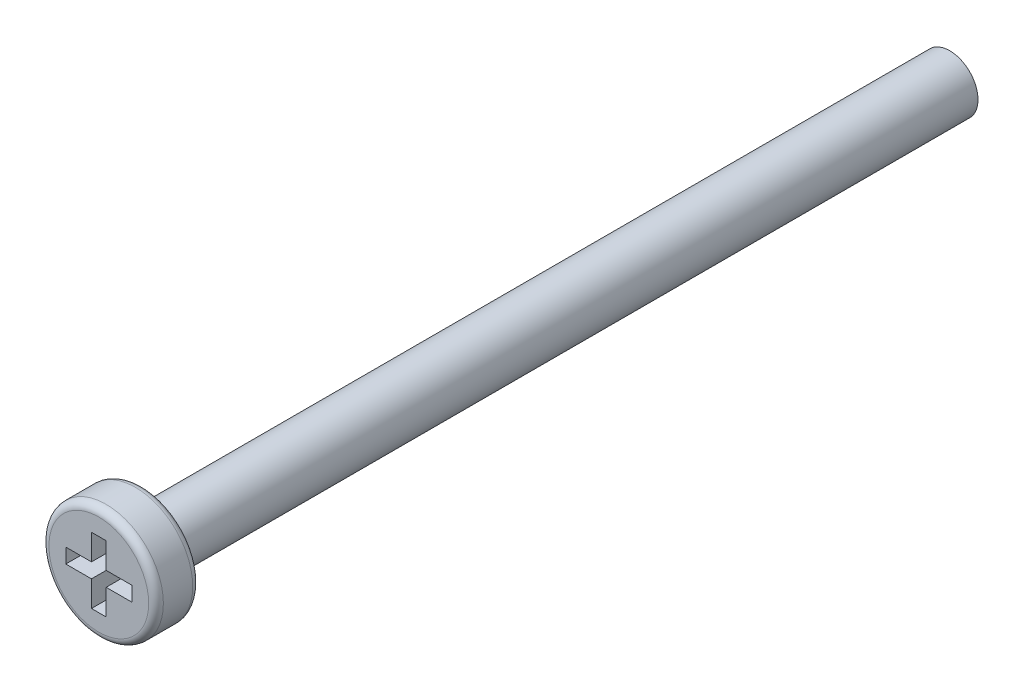
ISO-10303-21;
HEADER;
FILE_DESCRIPTION(('STEP AP214'),'2;1');
FILE_NAME('part.step','',(''),(''),'','','');
FILE_SCHEMA(('AUTOMOTIVE_DESIGN { 1 0 10303 214 1 1 1 1 }'));
ENDSEC;
DATA;
#1=APPLICATION_CONTEXT('core data for automotive mechanical design processes');
#2=APPLICATION_PROTOCOL_DEFINITION('international standard','automotive_design',2000,#1);
#3=PRODUCT_CONTEXT('',#1,'mechanical');
#4=PRODUCT('Part','Part','',(#3));
#5=PRODUCT_RELATED_PRODUCT_CATEGORY('part','',(#4));
#6=PRODUCT_DEFINITION_FORMATION('','',#4);
#7=PRODUCT_DEFINITION_CONTEXT('part definition',#1,'design');
#8=PRODUCT_DEFINITION('design','',#6,#7);
#9=PRODUCT_DEFINITION_SHAPE('','',#8);
#10=(LENGTH_UNIT() NAMED_UNIT(*) SI_UNIT(.MILLI.,.METRE.));
#11=(NAMED_UNIT(*) PLANE_ANGLE_UNIT() SI_UNIT($,.RADIAN.));
#12=(NAMED_UNIT(*) SI_UNIT($,.STERADIAN.) SOLID_ANGLE_UNIT());
#13=UNCERTAINTY_MEASURE_WITH_UNIT(LENGTH_MEASURE(1.E-05),#10,'distance_accuracy_value','');
#14=(GEOMETRIC_REPRESENTATION_CONTEXT(3) GLOBAL_UNCERTAINTY_ASSIGNED_CONTEXT((#13)) GLOBAL_UNIT_ASSIGNED_CONTEXT((#10,
#11,#12)) REPRESENTATION_CONTEXT('',''));
#15=CARTESIAN_POINT('',(0.,0.,0.));
#16=DIRECTION('',(0.,0.,1.));
#17=DIRECTION('',(1.,0.,0.));
#18=AXIS2_PLACEMENT_3D('',#15,#16,#17);
#19=CARTESIAN_POINT('',(0.,0.,0.));
#20=DIRECTION('',(0.,0.,1.));
#21=DIRECTION('',(1.,0.,0.));
#22=AXIS2_PLACEMENT_3D('',#19,#20,#21);
#23=PLANE('',#22);
#24=CARTESIAN_POINT('',(0.,0.,0.));
#25=DIRECTION('',(0.,0.,1.));
#26=DIRECTION('',(1.,0.,0.));
#27=AXIS2_PLACEMENT_3D('',#24,#25,#26);
#28=CIRCLE('',#27,3.4);
#29=CARTESIAN_POINT('',(3.4,0.,0.));
#30=VERTEX_POINT('',#29);
#31=EDGE_CURVE('E217',#30,#30,#28,.F.);
#32=ORIENTED_EDGE('',*,*,#31,.T.);
#33=EDGE_LOOP('',(#32));
#34=FACE_BOUND('',#33,.T.);
#35=CARTESIAN_POINT('',(0.,0.,0.));
#36=DIRECTION('',(0.,0.,1.));
#37=DIRECTION('',(1.,0.,0.));
#38=AXIS2_PLACEMENT_3D('',#35,#36,#37);
#39=CIRCLE('',#38,1.925);
#40=CARTESIAN_POINT('',(1.925,0.,0.));
#41=VERTEX_POINT('',#40);
#42=EDGE_CURVE('E11',#41,#41,#39,.F.);
#43=ORIENTED_EDGE('',*,*,#42,.F.);
#44=EDGE_LOOP('',(#43));
#45=FACE_BOUND('',#44,.T.);
#46=ADVANCED_FACE('F37',(#34,#45),#23,.F.);
#47=CARTESIAN_POINT('',(0.,0.,3.));
#48=DIRECTION('',(0.,0.,-1.));
#49=DIRECTION('',(-1.,0.,0.));
#50=AXIS2_PLACEMENT_3D('',#47,#48,#49);
#51=CYLINDRICAL_SURFACE('',#50,3.9);
#52=CARTESIAN_POINT('',(0.,0.,0.5));
#53=DIRECTION('',(0.,0.,1.));
#54=DIRECTION('',(1.,0.,0.));
#55=AXIS2_PLACEMENT_3D('',#52,#53,#54);
#56=CIRCLE('',#55,3.9);
#57=CARTESIAN_POINT('',(3.9,0.,0.5));
#58=VERTEX_POINT('',#57);
#59=EDGE_CURVE('E214',#58,#58,#56,.T.);
#60=ORIENTED_EDGE('',*,*,#59,.T.);
#61=EDGE_LOOP('',(#60));
#62=FACE_BOUND('',#61,.T.);
#63=CARTESIAN_POINT('',(0.,0.,2.5));
#64=DIRECTION('',(0.,0.,1.));
#65=DIRECTION('',(1.,0.,0.));
#66=AXIS2_PLACEMENT_3D('',#63,#64,#65);
#67=CIRCLE('',#66,3.9);
#68=CARTESIAN_POINT('',(3.9,0.,2.5));
#69=VERTEX_POINT('',#68);
#70=EDGE_CURVE('E194',#69,#69,#67,.F.);
#71=ORIENTED_EDGE('',*,*,#70,.T.);
#72=EDGE_LOOP('',(#71));
#73=FACE_BOUND('',#72,.T.);
#74=ADVANCED_FACE('F239',(#62,#73),#51,.T.);
#75=CARTESIAN_POINT('',(0.,0.,3.));
#76=DIRECTION('',(0.,0.,1.));
#77=DIRECTION('',(1.,0.,0.));
#78=AXIS2_PLACEMENT_3D('',#75,#76,#77);
#79=PLANE('',#78);
#80=CARTESIAN_POINT('',(0.,0.,3.));
#81=DIRECTION('',(0.,0.,1.));
#82=DIRECTION('',(1.,0.,0.));
#83=AXIS2_PLACEMENT_3D('',#80,#81,#82);
#84=CIRCLE('',#83,3.4);
#85=CARTESIAN_POINT('',(3.4,0.,3.));
#86=VERTEX_POINT('',#85);
#87=EDGE_CURVE('E45',#86,#86,#84,.T.);
#88=ORIENTED_EDGE('',*,*,#87,.T.);
#89=EDGE_LOOP('',(#88));
#90=FACE_BOUND('',#89,.T.);
#91=DIRECTION('',(0.,-1.,0.));
#92=VECTOR('',#91,1.);
#93=CARTESIAN_POINT('',(-0.5,-0.5,3.));
#94=LINE('',#93,#92);
#95=CARTESIAN_POINT('',(-0.5,-0.5,3.));
#96=VERTEX_POINT('',#95);
#97=CARTESIAN_POINT('',(-0.5,-2.25,3.));
#98=VERTEX_POINT('',#97);
#99=EDGE_CURVE('E52',#96,#98,#94,.T.);
#100=ORIENTED_EDGE('',*,*,#99,.F.);
#101=DIRECTION('',(1.,0.,0.));
#102=VECTOR('',#101,1.);
#103=CARTESIAN_POINT('',(-0.5,-0.5,3.));
#104=LINE('',#103,#102);
#105=CARTESIAN_POINT('',(-2.25,-0.5,3.));
#106=VERTEX_POINT('',#105);
#107=EDGE_CURVE('E190',#106,#96,#104,.T.);
#108=ORIENTED_EDGE('',*,*,#107,.F.);
#109=DIRECTION('',(0.,-1.,0.));
#110=VECTOR('',#109,1.);
#111=CARTESIAN_POINT('',(-2.25,0.5,3.));
#112=LINE('',#111,#110);
#113=CARTESIAN_POINT('',(-2.25,0.5,3.));
#114=VERTEX_POINT('',#113);
#115=EDGE_CURVE('E188',#114,#106,#112,.T.);
#116=ORIENTED_EDGE('',*,*,#115,.F.);
#117=DIRECTION('',(-1.,0.,0.));
#118=VECTOR('',#117,1.);
#119=CARTESIAN_POINT('',(-0.5,0.5,3.));
#120=LINE('',#119,#118);
#121=CARTESIAN_POINT('',(-0.5,0.5,3.));
#122=VERTEX_POINT('',#121);
#123=EDGE_CURVE('E136',#122,#114,#120,.T.);
#124=ORIENTED_EDGE('',*,*,#123,.F.);
#125=DIRECTION('',(0.,-1.,0.));
#126=VECTOR('',#125,1.);
#127=CARTESIAN_POINT('',(-0.5,2.25,3.));
#128=LINE('',#127,#126);
#129=CARTESIAN_POINT('',(-0.5,2.25,3.));
#130=VERTEX_POINT('',#129);
#131=EDGE_CURVE('E184',#130,#122,#128,.T.);
#132=ORIENTED_EDGE('',*,*,#131,.F.);
#133=DIRECTION('',(-1.,0.,0.));
#134=VECTOR('',#133,1.);
#135=CARTESIAN_POINT('',(0.5,2.25,3.));
#136=LINE('',#135,#134);
#137=CARTESIAN_POINT('',(0.5,2.25,3.));
#138=VERTEX_POINT('',#137);
#139=EDGE_CURVE('E181',#138,#130,#136,.T.);
#140=ORIENTED_EDGE('',*,*,#139,.F.);
#141=DIRECTION('',(0.,1.,0.));
#142=VECTOR('',#141,1.);
#143=CARTESIAN_POINT('',(0.5,2.25,3.));
#144=LINE('',#143,#142);
#145=CARTESIAN_POINT('',(0.5,0.5,3.));
#146=VERTEX_POINT('',#145);
#147=EDGE_CURVE('E178',#146,#138,#144,.T.);
#148=ORIENTED_EDGE('',*,*,#147,.F.);
#149=DIRECTION('',(-1.,0.,0.));
#150=VECTOR('',#149,1.);
#151=CARTESIAN_POINT('',(2.25,0.5,3.));
#152=LINE('',#151,#150);
#153=CARTESIAN_POINT('',(2.25,0.5,3.));
#154=VERTEX_POINT('',#153);
#155=EDGE_CURVE('E175',#154,#146,#152,.T.);
#156=ORIENTED_EDGE('',*,*,#155,.F.);
#157=DIRECTION('',(0.,1.,0.));
#158=VECTOR('',#157,1.);
#159=CARTESIAN_POINT('',(2.25,0.5,3.));
#160=LINE('',#159,#158);
#161=CARTESIAN_POINT('',(2.25,-0.5,3.));
#162=VERTEX_POINT('',#161);
#163=EDGE_CURVE('E172',#162,#154,#160,.T.);
#164=ORIENTED_EDGE('',*,*,#163,.F.);
#165=DIRECTION('',(1.,0.,0.));
#166=VECTOR('',#165,1.);
#167=CARTESIAN_POINT('',(2.25,-0.5,3.));
#168=LINE('',#167,#166);
#169=CARTESIAN_POINT('',(0.5,-0.5,3.));
#170=VERTEX_POINT('',#169);
#171=EDGE_CURVE('E169',#170,#162,#168,.T.);
#172=ORIENTED_EDGE('',*,*,#171,.F.);
#173=DIRECTION('',(0.,1.,0.));
#174=VECTOR('',#173,1.);
#175=CARTESIAN_POINT('',(0.5,-0.5,3.));
#176=LINE('',#175,#174);
#177=CARTESIAN_POINT('',(0.500000000000001,-2.25,3.));
#178=VERTEX_POINT('',#177);
#179=EDGE_CURVE('E166',#178,#170,#176,.T.);
#180=ORIENTED_EDGE('',*,*,#179,.F.);
#181=DIRECTION('',(1.,0.,0.));
#182=VECTOR('',#181,1.);
#183=CARTESIAN_POINT('',(0.500000000000001,-2.25,3.));
#184=LINE('',#183,#182);
#185=EDGE_CURVE('E162',#98,#178,#184,.T.);
#186=ORIENTED_EDGE('',*,*,#185,.F.);
#187=EDGE_LOOP('',(#100,#108,#116,#124,#132,#140,#148,#156,#164,#172,#180,#186));
#188=FACE_BOUND('',#187,.T.);
#189=ADVANCED_FACE('F222',(#90,#188),#79,.T.);
#190=CARTESIAN_POINT('',(-0.5,-0.5,1.));
#191=DIRECTION('',(-1.,0.,0.));
#192=DIRECTION('',(0.,-1.,0.));
#193=AXIS2_PLACEMENT_3D('',#190,#191,#192);
#194=PLANE('',#193);
#195=ORIENTED_EDGE('',*,*,#99,.T.);
#196=DIRECTION('',(0.,0.,1.));
#197=VECTOR('',#196,1.);
#198=CARTESIAN_POINT('',(-0.5,-2.25,1.));
#199=LINE('',#198,#197);
#200=CARTESIAN_POINT('',(-0.5,-2.25,1.));
#201=VERTEX_POINT('',#200);
#202=EDGE_CURVE('E100',#201,#98,#199,.T.);
#203=ORIENTED_EDGE('',*,*,#202,.F.);
#204=DIRECTION('',(0.,-1.,0.));
#205=VECTOR('',#204,1.);
#206=CARTESIAN_POINT('',(-0.5,-0.5,1.));
#207=LINE('',#206,#205);
#208=CARTESIAN_POINT('',(-0.5,-0.5,1.));
#209=VERTEX_POINT('',#208);
#210=EDGE_CURVE('E192',#209,#201,#207,.T.);
#211=ORIENTED_EDGE('',*,*,#210,.F.);
#212=DIRECTION('',(0.,0.,1.));
#213=VECTOR('',#212,1.);
#214=CARTESIAN_POINT('',(-0.5,-0.5,1.));
#215=LINE('',#214,#213);
#216=EDGE_CURVE('E60',#209,#96,#215,.T.);
#217=ORIENTED_EDGE('',*,*,#216,.T.);
#218=EDGE_LOOP('',(#195,#203,#211,#217));
#219=FACE_BOUND('',#218,.T.);
#220=ADVANCED_FACE('F251',(#219),#194,.F.);
#221=CARTESIAN_POINT('',(-0.5,-0.5,1.));
#222=DIRECTION('',(0.,-1.,0.));
#223=DIRECTION('',(1.,0.,0.));
#224=AXIS2_PLACEMENT_3D('',#221,#222,#223);
#225=PLANE('',#224);
#226=ORIENTED_EDGE('',*,*,#107,.T.);
#227=ORIENTED_EDGE('',*,*,#216,.F.);
#228=DIRECTION('',(1.,0.,0.));
#229=VECTOR('',#228,1.);
#230=CARTESIAN_POINT('',(-0.5,-0.5,1.));
#231=LINE('',#230,#229);
#232=CARTESIAN_POINT('',(-2.25,-0.5,1.));
#233=VERTEX_POINT('',#232);
#234=EDGE_CURVE('E148',#233,#209,#231,.T.);
#235=ORIENTED_EDGE('',*,*,#234,.F.);
#236=DIRECTION('',(0.,0.,1.));
#237=VECTOR('',#236,1.);
#238=CARTESIAN_POINT('',(-2.25,-0.5,1.));
#239=LINE('',#238,#237);
#240=EDGE_CURVE('E140',#233,#106,#239,.T.);
#241=ORIENTED_EDGE('',*,*,#240,.T.);
#242=EDGE_LOOP('',(#226,#227,#235,#241));
#243=FACE_BOUND('',#242,.T.);
#244=ADVANCED_FACE('F254',(#243),#225,.F.);
#245=CARTESIAN_POINT('',(-2.25,0.5,1.));
#246=DIRECTION('',(-1.,0.,0.));
#247=DIRECTION('',(0.,-1.,0.));
#248=AXIS2_PLACEMENT_3D('',#245,#246,#247);
#249=PLANE('',#248);
#250=ORIENTED_EDGE('',*,*,#115,.T.);
#251=ORIENTED_EDGE('',*,*,#240,.F.);
#252=DIRECTION('',(0.,-1.,0.));
#253=VECTOR('',#252,1.);
#254=CARTESIAN_POINT('',(-2.25,0.5,1.));
#255=LINE('',#254,#253);
#256=CARTESIAN_POINT('',(-2.25,0.5,1.));
#257=VERTEX_POINT('',#256);
#258=EDGE_CURVE('E144',#257,#233,#255,.T.);
#259=ORIENTED_EDGE('',*,*,#258,.F.);
#260=DIRECTION('',(0.,0.,1.));
#261=VECTOR('',#260,1.);
#262=CARTESIAN_POINT('',(-2.25,0.5,1.));
#263=LINE('',#262,#261);
#264=EDGE_CURVE('E129',#257,#114,#263,.T.);
#265=ORIENTED_EDGE('',*,*,#264,.T.);
#266=EDGE_LOOP('',(#250,#251,#259,#265));
#267=FACE_BOUND('',#266,.T.);
#268=ADVANCED_FACE('F145',(#267),#249,.F.);
#269=CARTESIAN_POINT('',(-0.5,0.5,1.));
#270=DIRECTION('',(0.,1.,0.));
#271=DIRECTION('',(-1.,0.,0.));
#272=AXIS2_PLACEMENT_3D('',#269,#270,#271);
#273=PLANE('',#272);
#274=ORIENTED_EDGE('',*,*,#123,.T.);
#275=ORIENTED_EDGE('',*,*,#264,.F.);
#276=DIRECTION('',(-1.,0.,0.));
#277=VECTOR('',#276,1.);
#278=CARTESIAN_POINT('',(-0.5,0.5,1.));
#279=LINE('',#278,#277);
#280=CARTESIAN_POINT('',(-0.5,0.5,1.));
#281=VERTEX_POINT('',#280);
#282=EDGE_CURVE('E133',#281,#257,#279,.T.);
#283=ORIENTED_EDGE('',*,*,#282,.F.);
#284=DIRECTION('',(0.,0.,1.));
#285=VECTOR('',#284,1.);
#286=CARTESIAN_POINT('',(-0.5,0.5,1.));
#287=LINE('',#286,#285);
#288=EDGE_CURVE('E141',#281,#122,#287,.T.);
#289=ORIENTED_EDGE('',*,*,#288,.T.);
#290=EDGE_LOOP('',(#274,#275,#283,#289));
#291=FACE_BOUND('',#290,.T.);
#292=ADVANCED_FACE('F131',(#291),#273,.F.);
#293=CARTESIAN_POINT('',(-0.5,2.25,1.));
#294=DIRECTION('',(-1.,0.,0.));
#295=DIRECTION('',(0.,-1.,0.));
#296=AXIS2_PLACEMENT_3D('',#293,#294,#295);
#297=PLANE('',#296);
#298=ORIENTED_EDGE('',*,*,#131,.T.);
#299=ORIENTED_EDGE('',*,*,#288,.F.);
#300=DIRECTION('',(0.,-1.,0.));
#301=VECTOR('',#300,1.);
#302=CARTESIAN_POINT('',(-0.5,2.25,1.));
#303=LINE('',#302,#301);
#304=CARTESIAN_POINT('',(-0.5,2.25,1.));
#305=VERTEX_POINT('',#304);
#306=EDGE_CURVE('E154',#305,#281,#303,.T.);
#307=ORIENTED_EDGE('',*,*,#306,.F.);
#308=DIRECTION('',(0.,0.,1.));
#309=VECTOR('',#308,1.);
#310=CARTESIAN_POINT('',(-0.5,2.25,1.));
#311=LINE('',#310,#309);
#312=EDGE_CURVE('E197',#305,#130,#311,.T.);
#313=ORIENTED_EDGE('',*,*,#312,.T.);
#314=EDGE_LOOP('',(#298,#299,#307,#313));
#315=FACE_BOUND('',#314,.T.);
#316=ADVANCED_FACE('F282',(#315),#297,.F.);
#317=CARTESIAN_POINT('',(0.5,2.25,1.));
#318=DIRECTION('',(0.,1.,0.));
#319=DIRECTION('',(-1.,0.,0.));
#320=AXIS2_PLACEMENT_3D('',#317,#318,#319);
#321=PLANE('',#320);
#322=ORIENTED_EDGE('',*,*,#139,.T.);
#323=ORIENTED_EDGE('',*,*,#312,.F.);
#324=DIRECTION('',(-1.,0.,0.));
#325=VECTOR('',#324,1.);
#326=CARTESIAN_POINT('',(0.5,2.25,1.));
#327=LINE('',#326,#325);
#328=CARTESIAN_POINT('',(0.5,2.25,1.));
#329=VERTEX_POINT('',#328);
#330=EDGE_CURVE('E156',#329,#305,#327,.T.);
#331=ORIENTED_EDGE('',*,*,#330,.F.);
#332=DIRECTION('',(0.,0.,1.));
#333=VECTOR('',#332,1.);
#334=CARTESIAN_POINT('',(0.5,2.25,1.));
#335=LINE('',#334,#333);
#336=EDGE_CURVE('E199',#329,#138,#335,.T.);
#337=ORIENTED_EDGE('',*,*,#336,.T.);
#338=EDGE_LOOP('',(#322,#323,#331,#337));
#339=FACE_BOUND('',#338,.T.);
#340=ADVANCED_FACE('F278',(#339),#321,.F.);
#341=CARTESIAN_POINT('',(0.5,2.25,1.));
#342=DIRECTION('',(1.,0.,0.));
#343=DIRECTION('',(0.,1.,0.));
#344=AXIS2_PLACEMENT_3D('',#341,#342,#343);
#345=PLANE('',#344);
#346=ORIENTED_EDGE('',*,*,#147,.T.);
#347=ORIENTED_EDGE('',*,*,#336,.F.);
#348=DIRECTION('',(0.,1.,0.));
#349=VECTOR('',#348,1.);
#350=CARTESIAN_POINT('',(0.5,2.25,1.));
#351=LINE('',#350,#349);
#352=CARTESIAN_POINT('',(0.5,0.5,1.));
#353=VERTEX_POINT('',#352);
#354=EDGE_CURVE('E319',#353,#329,#351,.T.);
#355=ORIENTED_EDGE('',*,*,#354,.F.);
#356=DIRECTION('',(0.,0.,1.));
#357=VECTOR('',#356,1.);
#358=CARTESIAN_POINT('',(0.5,0.5,1.));
#359=LINE('',#358,#357);
#360=EDGE_CURVE('E201',#353,#146,#359,.T.);
#361=ORIENTED_EDGE('',*,*,#360,.T.);
#362=EDGE_LOOP('',(#346,#347,#355,#361));
#363=FACE_BOUND('',#362,.T.);
#364=ADVANCED_FACE('F274',(#363),#345,.F.);
#365=CARTESIAN_POINT('',(2.25,0.5,1.));
#366=DIRECTION('',(0.,1.,0.));
#367=DIRECTION('',(-1.,0.,0.));
#368=AXIS2_PLACEMENT_3D('',#365,#366,#367);
#369=PLANE('',#368);
#370=ORIENTED_EDGE('',*,*,#155,.T.);
#371=ORIENTED_EDGE('',*,*,#360,.F.);
#372=DIRECTION('',(-1.,0.,0.));
#373=VECTOR('',#372,1.);
#374=CARTESIAN_POINT('',(2.25,0.5,1.));
#375=LINE('',#374,#373);
#376=CARTESIAN_POINT('',(2.25,0.5,1.));
#377=VERTEX_POINT('',#376);
#378=EDGE_CURVE('E316',#377,#353,#375,.T.);
#379=ORIENTED_EDGE('',*,*,#378,.F.);
#380=DIRECTION('',(0.,0.,1.));
#381=VECTOR('',#380,1.);
#382=CARTESIAN_POINT('',(2.25,0.5,1.));
#383=LINE('',#382,#381);
#384=EDGE_CURVE('E203',#377,#154,#383,.T.);
#385=ORIENTED_EDGE('',*,*,#384,.T.);
#386=EDGE_LOOP('',(#370,#371,#379,#385));
#387=FACE_BOUND('',#386,.T.);
#388=ADVANCED_FACE('F270',(#387),#369,.F.);
#389=CARTESIAN_POINT('',(2.25,0.5,1.));
#390=DIRECTION('',(1.,0.,0.));
#391=DIRECTION('',(0.,0.,-1.));
#392=AXIS2_PLACEMENT_3D('',#389,#390,#391);
#393=PLANE('',#392);
#394=ORIENTED_EDGE('',*,*,#163,.T.);
#395=ORIENTED_EDGE('',*,*,#384,.F.);
#396=DIRECTION('',(0.,1.,0.));
#397=VECTOR('',#396,1.);
#398=CARTESIAN_POINT('',(2.25,0.5,1.));
#399=LINE('',#398,#397);
#400=CARTESIAN_POINT('',(2.25,-0.5,1.));
#401=VERTEX_POINT('',#400);
#402=EDGE_CURVE('E313',#401,#377,#399,.T.);
#403=ORIENTED_EDGE('',*,*,#402,.F.);
#404=DIRECTION('',(0.,0.,1.));
#405=VECTOR('',#404,1.);
#406=CARTESIAN_POINT('',(2.25,-0.5,1.));
#407=LINE('',#406,#405);
#408=EDGE_CURVE('E205',#401,#162,#407,.T.);
#409=ORIENTED_EDGE('',*,*,#408,.T.);
#410=EDGE_LOOP('',(#394,#395,#403,#409));
#411=FACE_BOUND('',#410,.T.);
#412=ADVANCED_FACE('F266',(#411),#393,.F.);
#413=CARTESIAN_POINT('',(2.25,-0.5,1.));
#414=DIRECTION('',(0.,-1.,0.));
#415=DIRECTION('',(1.,0.,0.));
#416=AXIS2_PLACEMENT_3D('',#413,#414,#415);
#417=PLANE('',#416);
#418=ORIENTED_EDGE('',*,*,#171,.T.);
#419=ORIENTED_EDGE('',*,*,#408,.F.);
#420=DIRECTION('',(1.,0.,0.));
#421=VECTOR('',#420,1.);
#422=CARTESIAN_POINT('',(2.25,-0.5,1.));
#423=LINE('',#422,#421);
#424=CARTESIAN_POINT('',(0.5,-0.5,1.));
#425=VERTEX_POINT('',#424);
#426=EDGE_CURVE('E310',#425,#401,#423,.T.);
#427=ORIENTED_EDGE('',*,*,#426,.F.);
#428=DIRECTION('',(0.,0.,1.));
#429=VECTOR('',#428,1.);
#430=CARTESIAN_POINT('',(0.5,-0.5,1.));
#431=LINE('',#430,#429);
#432=EDGE_CURVE('E207',#425,#170,#431,.T.);
#433=ORIENTED_EDGE('',*,*,#432,.T.);
#434=EDGE_LOOP('',(#418,#419,#427,#433));
#435=FACE_BOUND('',#434,.T.);
#436=ADVANCED_FACE('F262',(#435),#417,.F.);
#437=CARTESIAN_POINT('',(0.5,-0.5,1.));
#438=DIRECTION('',(1.,0.,0.));
#439=DIRECTION('',(0.,1.,0.));
#440=AXIS2_PLACEMENT_3D('',#437,#438,#439);
#441=PLANE('',#440);
#442=ORIENTED_EDGE('',*,*,#179,.T.);
#443=ORIENTED_EDGE('',*,*,#432,.F.);
#444=DIRECTION('',(0.,1.,0.));
#445=VECTOR('',#444,1.);
#446=CARTESIAN_POINT('',(0.5,-0.5,1.));
#447=LINE('',#446,#445);
#448=CARTESIAN_POINT('',(0.500000000000001,-2.25,1.));
#449=VERTEX_POINT('',#448);
#450=EDGE_CURVE('E307',#449,#425,#447,.T.);
#451=ORIENTED_EDGE('',*,*,#450,.F.);
#452=DIRECTION('',(0.,0.,1.));
#453=VECTOR('',#452,1.);
#454=CARTESIAN_POINT('',(0.500000000000001,-2.25,1.));
#455=LINE('',#454,#453);
#456=EDGE_CURVE('E209',#449,#178,#455,.T.);
#457=ORIENTED_EDGE('',*,*,#456,.T.);
#458=EDGE_LOOP('',(#442,#443,#451,#457));
#459=FACE_BOUND('',#458,.T.);
#460=ADVANCED_FACE('F258',(#459),#441,.F.);
#461=CARTESIAN_POINT('',(0.500000000000001,-2.25,1.));
#462=DIRECTION('',(0.,-1.,0.));
#463=DIRECTION('',(1.,0.,0.));
#464=AXIS2_PLACEMENT_3D('',#461,#462,#463);
#465=PLANE('',#464);
#466=ORIENTED_EDGE('',*,*,#185,.T.);
#467=ORIENTED_EDGE('',*,*,#456,.F.);
#468=DIRECTION('',(1.,0.,0.));
#469=VECTOR('',#468,1.);
#470=CARTESIAN_POINT('',(0.500000000000001,-2.25,1.));
#471=LINE('',#470,#469);
#472=EDGE_CURVE('E304',#201,#449,#471,.T.);
#473=ORIENTED_EDGE('',*,*,#472,.F.);
#474=ORIENTED_EDGE('',*,*,#202,.T.);
#475=EDGE_LOOP('',(#466,#467,#473,#474));
#476=FACE_BOUND('',#475,.T.);
#477=ADVANCED_FACE('F255',(#476),#465,.F.);
#478=CARTESIAN_POINT('',(0.,0.,1.));
#479=DIRECTION('',(0.,0.,-1.));
#480=DIRECTION('',(-1.,0.,0.));
#481=AXIS2_PLACEMENT_3D('',#478,#479,#480);
#482=PLANE('',#481);
#483=ORIENTED_EDGE('',*,*,#210,.T.);
#484=ORIENTED_EDGE('',*,*,#472,.T.);
#485=ORIENTED_EDGE('',*,*,#450,.T.);
#486=ORIENTED_EDGE('',*,*,#426,.T.);
#487=ORIENTED_EDGE('',*,*,#402,.T.);
#488=ORIENTED_EDGE('',*,*,#378,.T.);
#489=ORIENTED_EDGE('',*,*,#354,.T.);
#490=ORIENTED_EDGE('',*,*,#330,.T.);
#491=ORIENTED_EDGE('',*,*,#306,.T.);
#492=ORIENTED_EDGE('',*,*,#282,.T.);
#493=ORIENTED_EDGE('',*,*,#258,.T.);
#494=ORIENTED_EDGE('',*,*,#234,.T.);
#495=EDGE_LOOP('',(#483,#484,#485,#486,#487,#488,#489,#490,#491,#492,#493,#494));
#496=FACE_BOUND('',#495,.T.);
#497=ADVANCED_FACE('F151',(#496),#482,.F.);
#498=CARTESIAN_POINT('',(0.,0.,0.5));
#499=DIRECTION('',(0.,0.,1.));
#500=DIRECTION('',(1.,0.,0.));
#501=AXIS2_PLACEMENT_3D('',#498,#499,#500);
#502=TOROIDAL_SURFACE('',#501,3.4,0.5);
#503=ORIENTED_EDGE('',*,*,#31,.F.);
#504=EDGE_LOOP('',(#503));
#505=FACE_BOUND('',#504,.T.);
#506=ORIENTED_EDGE('',*,*,#59,.F.);
#507=EDGE_LOOP('',(#506));
#508=FACE_BOUND('',#507,.T.);
#509=ADVANCED_FACE('F227',(#505,#508),#502,.T.);
#510=CARTESIAN_POINT('',(0.,0.,2.5));
#511=DIRECTION('',(0.,0.,1.));
#512=DIRECTION('',(1.,0.,0.));
#513=AXIS2_PLACEMENT_3D('',#510,#511,#512);
#514=TOROIDAL_SURFACE('',#513,3.4,0.5);
#515=ORIENTED_EDGE('',*,*,#70,.F.);
#516=EDGE_LOOP('',(#515));
#517=FACE_BOUND('',#516,.T.);
#518=ORIENTED_EDGE('',*,*,#87,.F.);
#519=EDGE_LOOP('',(#518));
#520=FACE_BOUND('',#519,.T.);
#521=ADVANCED_FACE('F39',(#517,#520),#514,.T.);
#522=CARTESIAN_POINT('',(0.,0.,-55.));
#523=DIRECTION('',(0.,0.,1.));
#524=DIRECTION('',(1.,0.,0.));
#525=AXIS2_PLACEMENT_3D('',#522,#523,#524);
#526=CYLINDRICAL_SURFACE('',#525,1.925);
#527=CARTESIAN_POINT('',(0.,0.,-55.));
#528=DIRECTION('',(0.,0.,-1.));
#529=DIRECTION('',(-1.,0.,0.));
#530=AXIS2_PLACEMENT_3D('',#527,#528,#529);
#531=CIRCLE('',#530,1.925);
#532=CARTESIAN_POINT('',(-1.925,0.,-55.));
#533=VERTEX_POINT('',#532);
#534=EDGE_CURVE('E163',#533,#533,#531,.T.);
#535=ORIENTED_EDGE('',*,*,#534,.F.);
#536=EDGE_LOOP('',(#535));
#537=FACE_BOUND('',#536,.T.);
#538=ORIENTED_EDGE('',*,*,#42,.T.);
#539=EDGE_LOOP('',(#538));
#540=FACE_BOUND('',#539,.T.);
#541=ADVANCED_FACE('F226',(#537,#540),#526,.T.);
#542=CARTESIAN_POINT('',(0.,0.,-55.));
#543=DIRECTION('',(0.,0.,-1.));
#544=DIRECTION('',(-1.,0.,0.));
#545=AXIS2_PLACEMENT_3D('',#542,#543,#544);
#546=PLANE('',#545);
#547=ORIENTED_EDGE('',*,*,#534,.T.);
#548=EDGE_LOOP('',(#547));
#549=FACE_BOUND('',#548,.T.);
#550=ADVANCED_FACE('F233',(#549),#546,.T.);
#551=CLOSED_SHELL('',(#46,#74,#189,#220,#244,#268,#292,#316,#340,#364,#388,#412,#436,#460,#477,
#497,#509,#521,#541,#550));
#552=MANIFOLD_SOLID_BREP('B2',#551);
#553=ADVANCED_BREP_SHAPE_REPRESENTATION('',(#18,#552),#14);
#554=SHAPE_DEFINITION_REPRESENTATION(#9,#553);
ENDSEC;
END-ISO-10303-21;
